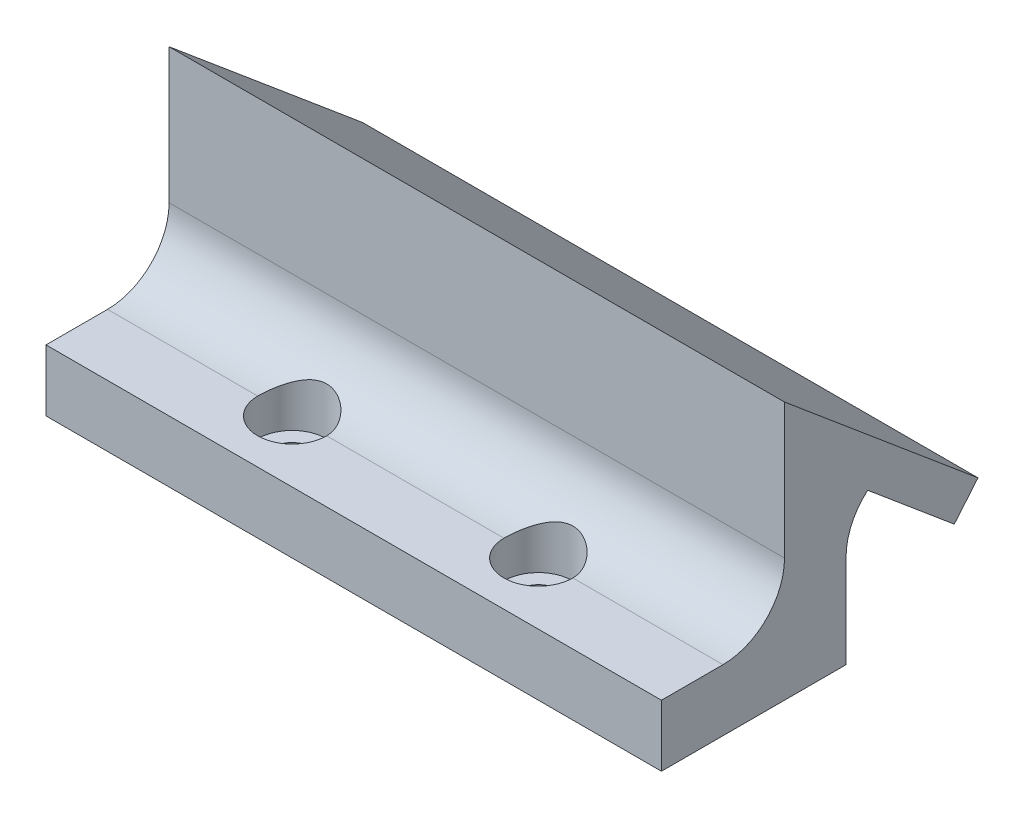
ISO-10303-21;
HEADER;
FILE_DESCRIPTION(('STEP AP214'),'2;1');
FILE_NAME('part.step','',(''),(''),'','','');
FILE_SCHEMA(('AUTOMOTIVE_DESIGN { 1 0 10303 214 1 1 1 1 }'));
ENDSEC;
DATA;
#1=APPLICATION_CONTEXT('core data for automotive mechanical design processes');
#2=APPLICATION_PROTOCOL_DEFINITION('international standard','automotive_design',2000,#1);
#3=PRODUCT_CONTEXT('',#1,'mechanical');
#4=PRODUCT('Part','Part','',(#3));
#5=PRODUCT_RELATED_PRODUCT_CATEGORY('part','',(#4));
#6=PRODUCT_DEFINITION_FORMATION('','',#4);
#7=PRODUCT_DEFINITION_CONTEXT('part definition',#1,'design');
#8=PRODUCT_DEFINITION('design','',#6,#7);
#9=PRODUCT_DEFINITION_SHAPE('','',#8);
#10=(LENGTH_UNIT() NAMED_UNIT(*) SI_UNIT(.MILLI.,.METRE.));
#11=(NAMED_UNIT(*) PLANE_ANGLE_UNIT() SI_UNIT($,.RADIAN.));
#12=(NAMED_UNIT(*) SI_UNIT($,.STERADIAN.) SOLID_ANGLE_UNIT());
#13=UNCERTAINTY_MEASURE_WITH_UNIT(LENGTH_MEASURE(1.E-05),#10,'distance_accuracy_value','');
#14=(GEOMETRIC_REPRESENTATION_CONTEXT(3) GLOBAL_UNCERTAINTY_ASSIGNED_CONTEXT((#13)) GLOBAL_UNIT_ASSIGNED_CONTEXT((#10,
#11,#12)) REPRESENTATION_CONTEXT('',''));
#15=CARTESIAN_POINT('',(0.,0.,0.));
#16=DIRECTION('',(0.,0.,1.));
#17=DIRECTION('',(1.,0.,0.));
#18=AXIS2_PLACEMENT_3D('',#15,#16,#17);
#19=CARTESIAN_POINT('',(5.,5.,-5.));
#20=DIRECTION('',(0.,-1.,0.));
#21=DIRECTION('',(0.,0.,-1.));
#22=AXIS2_PLACEMENT_3D('',#19,#20,#21);
#23=CYLINDRICAL_SURFACE('',#22,1.6);
#24=CARTESIAN_POINT('',(5.,0.,-5.));
#25=DIRECTION('',(0.,1.,0.));
#26=DIRECTION('',(0.,0.,1.));
#27=AXIS2_PLACEMENT_3D('',#24,#25,#26);
#28=CIRCLE('',#27,1.6);
#29=CARTESIAN_POINT('',(5.,0.,-3.4));
#30=VERTEX_POINT('',#29);
#31=EDGE_CURVE('E194',#30,#30,#28,.T.);
#32=ORIENTED_EDGE('',*,*,#31,.F.);
#33=EDGE_LOOP('',(#32));
#34=FACE_BOUND('',#33,.T.);
#35=CARTESIAN_POINT('',(5.,2.,-5.));
#36=DIRECTION('',(0.,1.,0.));
#37=DIRECTION('',(0.,0.,1.));
#38=AXIS2_PLACEMENT_3D('',#35,#36,#37);
#39=CIRCLE('',#38,1.6);
#40=CARTESIAN_POINT('',(5.,2.,-3.4));
#41=VERTEX_POINT('',#40);
#42=EDGE_CURVE('E195',#41,#41,#39,.T.);
#43=ORIENTED_EDGE('',*,*,#42,.T.);
#44=EDGE_LOOP('',(#43));
#45=FACE_BOUND('',#44,.T.);
#46=ADVANCED_FACE('F32',(#34,#45),#23,.F.);
#47=CARTESIAN_POINT('',(25.,5.,-5.));
#48=DIRECTION('',(0.,-1.,0.));
#49=DIRECTION('',(0.,0.,-1.));
#50=AXIS2_PLACEMENT_3D('',#47,#48,#49);
#51=CYLINDRICAL_SURFACE('',#50,1.6);
#52=CARTESIAN_POINT('',(25.,0.,-5.));
#53=DIRECTION('',(0.,1.,0.));
#54=DIRECTION('',(0.,0.,1.));
#55=AXIS2_PLACEMENT_3D('',#52,#53,#54);
#56=CIRCLE('',#55,1.6);
#57=CARTESIAN_POINT('',(25.,0.,-3.4));
#58=VERTEX_POINT('',#57);
#59=EDGE_CURVE('E191',#58,#58,#56,.T.);
#60=ORIENTED_EDGE('',*,*,#59,.F.);
#61=EDGE_LOOP('',(#60));
#62=FACE_BOUND('',#61,.T.);
#63=CARTESIAN_POINT('',(25.,2.,-5.));
#64=DIRECTION('',(0.,1.,0.));
#65=DIRECTION('',(0.,0.,1.));
#66=AXIS2_PLACEMENT_3D('',#63,#64,#65);
#67=CIRCLE('',#66,1.6);
#68=CARTESIAN_POINT('',(25.,2.,-3.4));
#69=VERTEX_POINT('',#68);
#70=EDGE_CURVE('E182',#69,#69,#67,.T.);
#71=ORIENTED_EDGE('',*,*,#70,.T.);
#72=EDGE_LOOP('',(#71));
#73=FACE_BOUND('',#72,.T.);
#74=ADVANCED_FACE('F252',(#62,#73),#51,.F.);
#75=CARTESIAN_POINT('',(0.,5.,0.));
#76=DIRECTION('',(0.,-1.,0.));
#77=DIRECTION('',(0.,0.,-1.));
#78=AXIS2_PLACEMENT_3D('',#75,#76,#77);
#79=PLANE('',#78);
#80=DIRECTION('',(0.,0.,1.));
#81=VECTOR('',#80,1.);
#82=CARTESIAN_POINT('',(40.,5.,-10.));
#83=LINE('',#82,#81);
#84=CARTESIAN_POINT('',(40.,5.,-4.99999999999999));
#85=VERTEX_POINT('',#84);
#86=CARTESIAN_POINT('',(40.,5.,0.));
#87=VERTEX_POINT('',#86);
#88=EDGE_CURVE('E158',#85,#87,#83,.T.);
#89=ORIENTED_EDGE('',*,*,#88,.F.);
#90=DIRECTION('',(-1.,0.,0.));
#91=VECTOR('',#90,1.);
#92=CARTESIAN_POINT('',(-10.,5.,-5.00000000000001));
#93=LINE('',#92,#91);
#94=CARTESIAN_POINT('',(27.8,5.,-4.99999999999999));
#95=VERTEX_POINT('',#94);
#96=EDGE_CURVE('E211',#85,#95,#93,.T.);
#97=ORIENTED_EDGE('',*,*,#96,.T.);
#98=CARTESIAN_POINT('',(25.,5.,-5.));
#99=DIRECTION('',(0.,1.,0.));
#100=DIRECTION('',(0.,0.,1.));
#101=AXIS2_PLACEMENT_3D('',#98,#99,#100);
#102=CIRCLE('',#101,2.8);
#103=CARTESIAN_POINT('',(22.2,5.,-4.99999999999999));
#104=VERTEX_POINT('',#103);
#105=EDGE_CURVE('E178',#104,#95,#102,.T.);
#106=ORIENTED_EDGE('',*,*,#105,.F.);
#107=DIRECTION('',(-1.,0.,0.));
#108=VECTOR('',#107,1.);
#109=CARTESIAN_POINT('',(-10.,5.,-5.00000000000001));
#110=LINE('',#109,#108);
#111=CARTESIAN_POINT('',(7.8,5.,-5.));
#112=VERTEX_POINT('',#111);
#113=EDGE_CURVE('E209',#104,#112,#110,.T.);
#114=ORIENTED_EDGE('',*,*,#113,.T.);
#115=CARTESIAN_POINT('',(5.,5.,-5.));
#116=DIRECTION('',(0.,1.,0.));
#117=DIRECTION('',(0.,0.,1.));
#118=AXIS2_PLACEMENT_3D('',#115,#116,#117);
#119=CIRCLE('',#118,2.8);
#120=CARTESIAN_POINT('',(2.2,5.,-5.));
#121=VERTEX_POINT('',#120);
#122=EDGE_CURVE('E183',#121,#112,#119,.T.);
#123=ORIENTED_EDGE('',*,*,#122,.F.);
#124=DIRECTION('',(-1.,0.,0.));
#125=VECTOR('',#124,1.);
#126=CARTESIAN_POINT('',(-10.,5.,-5.00000000000001));
#127=LINE('',#126,#125);
#128=CARTESIAN_POINT('',(-10.,5.,-5.00000000000001));
#129=VERTEX_POINT('',#128);
#130=EDGE_CURVE('E202',#121,#129,#127,.T.);
#131=ORIENTED_EDGE('',*,*,#130,.T.);
#132=DIRECTION('',(0.,0.,-1.));
#133=VECTOR('',#132,1.);
#134=CARTESIAN_POINT('',(-10.,5.,-10.));
#135=LINE('',#134,#133);
#136=CARTESIAN_POINT('',(-10.,5.,0.));
#137=VERTEX_POINT('',#136);
#138=EDGE_CURVE('E166',#137,#129,#135,.T.);
#139=ORIENTED_EDGE('',*,*,#138,.F.);
#140=DIRECTION('',(1.,0.,0.));
#141=VECTOR('',#140,1.);
#142=CARTESIAN_POINT('',(0.,5.,0.));
#143=LINE('',#142,#141);
#144=EDGE_CURVE('E199',#137,#87,#143,.T.);
#145=ORIENTED_EDGE('',*,*,#144,.T.);
#146=EDGE_LOOP('',(#89,#97,#106,#114,#123,#131,#139,#145));
#147=FACE_BOUND('',#146,.T.);
#148=ADVANCED_FACE('F248',(#147),#79,.F.);
#149=CARTESIAN_POINT('',(0.,0.,0.));
#150=DIRECTION('',(0.,-1.,0.));
#151=DIRECTION('',(0.,0.,-1.));
#152=AXIS2_PLACEMENT_3D('',#149,#150,#151);
#153=PLANE('',#152);
#154=ORIENTED_EDGE('',*,*,#31,.T.);
#155=EDGE_LOOP('',(#154));
#156=FACE_BOUND('',#155,.T.);
#157=DIRECTION('',(1.,0.,0.));
#158=VECTOR('',#157,1.);
#159=CARTESIAN_POINT('',(0.,0.,0.));
#160=LINE('',#159,#158);
#161=CARTESIAN_POINT('',(-10.,0.,0.));
#162=VERTEX_POINT('',#161);
#163=CARTESIAN_POINT('',(40.,0.,0.));
#164=VERTEX_POINT('',#163);
#165=EDGE_CURVE('E198',#162,#164,#160,.T.);
#166=ORIENTED_EDGE('',*,*,#165,.F.);
#167=DIRECTION('',(0.,0.,1.));
#168=VECTOR('',#167,1.);
#169=CARTESIAN_POINT('',(-10.,0.,-10.));
#170=LINE('',#169,#168);
#171=CARTESIAN_POINT('',(-10.,0.,-15.));
#172=VERTEX_POINT('',#171);
#173=EDGE_CURVE('E160',#172,#162,#170,.T.);
#174=ORIENTED_EDGE('',*,*,#173,.F.);
#175=DIRECTION('',(1.,0.,0.));
#176=VECTOR('',#175,1.);
#177=CARTESIAN_POINT('',(-10.,0.,-15.));
#178=LINE('',#177,#176);
#179=CARTESIAN_POINT('',(40.,0.,-15.));
#180=VERTEX_POINT('',#179);
#181=EDGE_CURVE('E175',#172,#180,#178,.T.);
#182=ORIENTED_EDGE('',*,*,#181,.T.);
#183=DIRECTION('',(0.,0.,-1.));
#184=VECTOR('',#183,1.);
#185=CARTESIAN_POINT('',(40.,0.,0.));
#186=LINE('',#185,#184);
#187=EDGE_CURVE('E152',#164,#180,#186,.T.);
#188=ORIENTED_EDGE('',*,*,#187,.F.);
#189=EDGE_LOOP('',(#166,#174,#182,#188));
#190=FACE_BOUND('',#189,.T.);
#191=ORIENTED_EDGE('',*,*,#59,.T.);
#192=EDGE_LOOP('',(#191));
#193=FACE_BOUND('',#192,.T.);
#194=ADVANCED_FACE('F244',(#156,#190,#193),#153,.T.);
#195=CARTESIAN_POINT('',(0.,5.,0.));
#196=DIRECTION('',(0.,0.,-1.));
#197=DIRECTION('',(-1.,0.,0.));
#198=AXIS2_PLACEMENT_3D('',#195,#196,#197);
#199=PLANE('',#198);
#200=ORIENTED_EDGE('',*,*,#165,.T.);
#201=DIRECTION('',(0.,-1.,0.));
#202=VECTOR('',#201,1.);
#203=CARTESIAN_POINT('',(40.,5.,0.));
#204=LINE('',#203,#202);
#205=EDGE_CURVE('E149',#87,#164,#204,.T.);
#206=ORIENTED_EDGE('',*,*,#205,.F.);
#207=ORIENTED_EDGE('',*,*,#144,.F.);
#208=DIRECTION('',(0.,1.,0.));
#209=VECTOR('',#208,1.);
#210=CARTESIAN_POINT('',(-10.,5.,0.));
#211=LINE('',#210,#209);
#212=EDGE_CURVE('E163',#162,#137,#211,.T.);
#213=ORIENTED_EDGE('',*,*,#212,.F.);
#214=EDGE_LOOP('',(#200,#206,#207,#213));
#215=FACE_BOUND('',#214,.T.);
#216=ADVANCED_FACE('F240',(#215),#199,.F.);
#217=CARTESIAN_POINT('',(25.,2.,-5.));
#218=DIRECTION('',(0.,1.,0.));
#219=DIRECTION('',(0.,0.,1.));
#220=AXIS2_PLACEMENT_3D('',#217,#218,#219);
#221=CYLINDRICAL_SURFACE('',#220,2.8);
#222=CARTESIAN_POINT('',(25.,2.,-5.));
#223=DIRECTION('',(0.,1.,0.));
#224=DIRECTION('',(0.,0.,1.));
#225=AXIS2_PLACEMENT_3D('',#222,#223,#224);
#226=CIRCLE('',#225,2.8);
#227=CARTESIAN_POINT('',(25.,2.,-2.2));
#228=VERTEX_POINT('',#227);
#229=EDGE_CURVE('E186',#228,#228,#226,.T.);
#230=ORIENTED_EDGE('',*,*,#229,.F.);
#231=EDGE_LOOP('',(#230));
#232=FACE_BOUND('',#231,.T.);
#233=ORIENTED_EDGE('',*,*,#105,.T.);
#234=CARTESIAN_POINT('',(27.8,5.,-4.99999999999999));
#235=CARTESIAN_POINT('',(27.8000126192588,4.99998601312472,-5.07279241567022));
#236=CARTESIAN_POINT('',(27.7971617749903,5.0015892331611,-5.14557563720954));
#237=CARTESIAN_POINT('',(27.7858311141548,5.00792481182699,-5.29053262710298));
#238=CARTESIAN_POINT('',(27.7773539108875,5.01265571772254,-5.36270666265454));
#239=CARTESIAN_POINT('',(27.754926055572,5.02510951388782,-5.50555509390766));
#240=CARTESIAN_POINT('',(27.7410037349057,5.03281691464609,-5.57623528738965));
#241=CARTESIAN_POINT('',(27.7078700747856,5.0510232543311,-5.71596214610274));
#242=CARTESIAN_POINT('',(27.6886583397865,5.06152240202423,-5.78500868874901));
#243=CARTESIAN_POINT('',(27.6234613019935,5.09681823866923,-5.98880111496992));
#244=CARTESIAN_POINT('',(27.5698596709923,5.12544467793267,-6.12053955595062));
#245=CARTESIAN_POINT('',(27.4443766963702,5.19041538249203,-6.37293869664888));
#246=CARTESIAN_POINT('',(27.3724748746711,5.2267682862057,-6.49358677892571));
#247=CARTESIAN_POINT('',(27.2068119832663,5.30698414120924,-6.72980047729093));
#248=CARTESIAN_POINT('',(27.1118753202332,5.3511942070472,-6.84442330056216));
#249=CARTESIAN_POINT('',(26.9054330895384,5.44126720443915,-7.05701658684002));
#250=CARTESIAN_POINT('',(26.7939118046691,5.48713167229175,-7.15497106239085));
#251=CARTESIAN_POINT('',(26.5437776406316,5.58090114724058,-7.3417016232965));
#252=CARTESIAN_POINT('',(26.4035556704179,5.62852649346677,-7.42848023070925));
#253=CARTESIAN_POINT('',(26.107759278362,5.71429715607025,-7.57684668047029));
#254=CARTESIAN_POINT('',(25.9522078945039,5.75245640403028,-7.6384716296407));
#255=CARTESIAN_POINT('',(25.6641729510852,5.80648046491585,-7.72329985246293));
#256=CARTESIAN_POINT('',(25.5338435971426,5.82536420171947,-7.75189401609168));
#257=CARTESIAN_POINT('',(25.269308952908,5.85087139202225,-7.79021262840044));
#258=CARTESIAN_POINT('',(25.1351076393797,5.8575069997297,-7.79995578399908));
#259=CARTESIAN_POINT('',(24.8665440392472,5.85756676689865,-7.80004397547245));
#260=CARTESIAN_POINT('',(24.7321817474793,5.8509755061371,-7.79036637012489));
#261=CARTESIAN_POINT('',(24.4673471502753,5.82551838594795,-7.75212819857548));
#262=CARTESIAN_POINT('',(24.3368773998415,5.80664464214648,-7.723555503043));
#263=CARTESIAN_POINT('',(24.0831298088093,5.75911696405302,-7.64893207360715));
#264=CARTESIAN_POINT('',(23.959845882105,5.730471451246,-7.60289638580845));
#265=CARTESIAN_POINT('',(23.7223493578851,5.66649310264978,-7.49492482660402));
#266=CARTESIAN_POINT('',(23.608140498645,5.63115753110377,-7.43298244679016));
#267=CARTESIAN_POINT('',(23.3733378850603,5.55117731196457,-7.28389382073814));
#268=CARTESIAN_POINT('',(23.2544760380035,5.50593744769173,-7.1943338040606));
#269=CARTESIAN_POINT('',(23.0323764514554,5.41510532041184,-6.9976270304732));
#270=CARTESIAN_POINT('',(22.9291528339514,5.36951277750616,-6.89046455763669));
#271=CARTESIAN_POINT('',(22.7303131703048,5.27740454575841,-6.64789611393537));
#272=CARTESIAN_POINT('',(22.636645208127,5.23129790967822,-6.51070385621199));
#273=CARTESIAN_POINT('',(22.5148836239945,5.1694098427908,-6.2927260542263));
#274=CARTESIAN_POINT('',(22.4774257996207,5.14999582570145,-6.21805239947647));
#275=CARTESIAN_POINT('',(22.4091279558927,5.11412555441173,-6.06507429899998));
#276=CARTESIAN_POINT('',(22.3782838655198,5.09766748172808,-5.9867721230844));
#277=CARTESIAN_POINT('',(22.3263401221466,5.06968274166836,-5.83505728422271));
#278=CARTESIAN_POINT('',(22.304576984013,5.05782867024697,-5.76193119148331));
#279=CARTESIAN_POINT('',(22.2670219917908,5.03724640932448,-5.61373676298384));
#280=CARTESIAN_POINT('',(22.2512290526789,5.02851765184447,-5.5386687827943));
#281=CARTESIAN_POINT('',(22.2257590244483,5.01439137660924,-5.38671731526305));
#282=CARTESIAN_POINT('',(22.2161196070238,5.00901438288609,-5.30982557845581));
#283=CARTESIAN_POINT('',(22.2032294739358,5.00180823793576,-5.15529306996077));
#284=CARTESIAN_POINT('',(22.1999830569199,4.99998147389048,-5.07765182953498));
#285=CARTESIAN_POINT('',(22.2,5.,-5.));
#286=B_SPLINE_CURVE_WITH_KNOTS('',3,(#234,#235,#236,#237,#238,#239,#240,#241,#242,#243,#244,
#245,#246,#247,#248,#249,#250,#251,#252,#253,#254,#255,#256,#257,#258,#259,#260,#261,#262,#263,
#264,#265,#266,#267,#268,#269,#270,#271,#272,#273,#274,#275,#276,#277,#278,#279,#280,#281,#282,
#283,#284,#285),.UNSPECIFIED.,.F.,.F.,(4,2,2,2,2,2,2,2,2,2,2,2,2,2,2,2,2,2,2,2,2,2,2,2,2,4),(0.,
0.218288596011022,0.436475873447967,0.653542692758751,0.870625748858909,1.30376844272026,
1.73739797466487,2.20129948349906,2.66564346594372,3.17801869585317,3.68963531102425,
4.0921540282531,4.49427309816508,4.896861241171,5.29970806888901,5.70220858947327,
6.10487406096022,6.56964228967561,7.03482775371849,7.54903613430851,7.80603100005664,
8.0628672181312,8.29419957513107,8.52548986958242,8.75818287120413,8.99103228202939),.UNSPECIFIED.);
#287=EDGE_CURVE('E217',#95,#104,#286,.T.);
#288=ORIENTED_EDGE('',*,*,#287,.T.);
#289=EDGE_LOOP('',(#233,#288));
#290=FACE_BOUND('',#289,.T.);
#291=ADVANCED_FACE('F231',(#232,#290),#221,.F.);
#292=CARTESIAN_POINT('',(25.,2.,-5.));
#293=DIRECTION('',(0.,1.,0.));
#294=DIRECTION('',(0.,0.,1.));
#295=AXIS2_PLACEMENT_3D('',#292,#293,#294);
#296=PLANE('',#295);
#297=ORIENTED_EDGE('',*,*,#70,.F.);
#298=EDGE_LOOP('',(#297));
#299=FACE_BOUND('',#298,.T.);
#300=ORIENTED_EDGE('',*,*,#229,.T.);
#301=EDGE_LOOP('',(#300));
#302=FACE_BOUND('',#301,.T.);
#303=ADVANCED_FACE('F264',(#299,#302),#296,.T.);
#304=CARTESIAN_POINT('',(5.,2.,-5.));
#305=DIRECTION('',(0.,1.,0.));
#306=DIRECTION('',(0.,0.,1.));
#307=AXIS2_PLACEMENT_3D('',#304,#305,#306);
#308=CYLINDRICAL_SURFACE('',#307,2.8);
#309=CARTESIAN_POINT('',(5.,2.,-5.));
#310=DIRECTION('',(0.,1.,0.));
#311=DIRECTION('',(0.,0.,1.));
#312=AXIS2_PLACEMENT_3D('',#309,#310,#311);
#313=CIRCLE('',#312,2.8);
#314=CARTESIAN_POINT('',(5.,2.,-2.2));
#315=VERTEX_POINT('',#314);
#316=EDGE_CURVE('E179',#315,#315,#313,.T.);
#317=ORIENTED_EDGE('',*,*,#316,.F.);
#318=EDGE_LOOP('',(#317));
#319=FACE_BOUND('',#318,.T.);
#320=ORIENTED_EDGE('',*,*,#122,.T.);
#321=CARTESIAN_POINT('',(7.8,5.,-5.));
#322=CARTESIAN_POINT('',(7.80001261925879,4.99998601312472,-5.07279241567022));
#323=CARTESIAN_POINT('',(7.79716177499028,5.0015892331611,-5.14557563720954));
#324=CARTESIAN_POINT('',(7.78583111415482,5.00792481182699,-5.29053262710299));
#325=CARTESIAN_POINT('',(7.77735391088753,5.01265571772254,-5.36270666265454));
#326=CARTESIAN_POINT('',(7.75492605557198,5.02510951388782,-5.50555509390767));
#327=CARTESIAN_POINT('',(7.74100373490567,5.03281691464609,-5.57623528738966));
#328=CARTESIAN_POINT('',(7.70787007478559,5.0510232543311,-5.71596214610274));
#329=CARTESIAN_POINT('',(7.68865833978646,5.06152240202423,-5.78500868874902));
#330=CARTESIAN_POINT('',(7.6234613019935,5.09681823866923,-5.98880111496993));
#331=CARTESIAN_POINT('',(7.56985967099229,5.12544467793267,-6.12053955595063));
#332=CARTESIAN_POINT('',(7.44437669637023,5.19041538249203,-6.37293869664889));
#333=CARTESIAN_POINT('',(7.37247487467112,5.2267682862057,-6.49358677892572));
#334=CARTESIAN_POINT('',(7.2068119832663,5.30698414120924,-6.72980047729093));
#335=CARTESIAN_POINT('',(7.11187532023314,5.3511942070472,-6.84442330056217));
#336=CARTESIAN_POINT('',(6.90543308953843,5.44126720443915,-7.05701658684003));
#337=CARTESIAN_POINT('',(6.79391180466908,5.48713167229175,-7.15497106239086));
#338=CARTESIAN_POINT('',(6.54377764063163,5.58090114724058,-7.34170162329651));
#339=CARTESIAN_POINT('',(6.40355567041786,5.62852649346676,-7.42848023070925));
#340=CARTESIAN_POINT('',(6.10775927836194,5.71429715607025,-7.57684668047029));
#341=CARTESIAN_POINT('',(5.95220789450394,5.75245640403028,-7.63847162964071));
#342=CARTESIAN_POINT('',(5.66417295108516,5.80648046491585,-7.72329985246293));
#343=CARTESIAN_POINT('',(5.53384359714257,5.82536420171946,-7.75189401609168));
#344=CARTESIAN_POINT('',(5.26930895290803,5.85087139202225,-7.79021262840044));
#345=CARTESIAN_POINT('',(5.13510763937966,5.8575069997297,-7.79995578399908));
#346=CARTESIAN_POINT('',(4.86654403924724,5.85756676689864,-7.80004397547245));
#347=CARTESIAN_POINT('',(4.73218174747925,5.8509755061371,-7.79036637012489));
#348=CARTESIAN_POINT('',(4.46734715027532,5.82551838594794,-7.75212819857548));
#349=CARTESIAN_POINT('',(4.33687739984148,5.80664464214648,-7.723555503043));
#350=CARTESIAN_POINT('',(4.08312980880931,5.75911696405302,-7.64893207360714));
#351=CARTESIAN_POINT('',(3.95984588210503,5.73047145124599,-7.60289638580845));
#352=CARTESIAN_POINT('',(3.7223493578851,5.66649310264977,-7.49492482660401));
#353=CARTESIAN_POINT('',(3.60814049864499,5.63115753110377,-7.43298244679016));
#354=CARTESIAN_POINT('',(3.37333788506028,5.55117731196457,-7.28389382073813));
#355=CARTESIAN_POINT('',(3.25447603800349,5.50593744769173,-7.19433380406059));
#356=CARTESIAN_POINT('',(3.03237645145543,5.41510532041183,-6.99762703047319));
#357=CARTESIAN_POINT('',(2.92915283395134,5.36951277750615,-6.89046455763668));
#358=CARTESIAN_POINT('',(2.73031317030476,5.27740454575841,-6.64789611393536));
#359=CARTESIAN_POINT('',(2.63664520812703,5.23129790967821,-6.51070385621198));
#360=CARTESIAN_POINT('',(2.51488362399448,5.16940984279079,-6.29272605422629));
#361=CARTESIAN_POINT('',(2.47742579962072,5.14999582570144,-6.21805239947646));
#362=CARTESIAN_POINT('',(2.40912795589269,5.11412555441172,-6.06507429899997));
#363=CARTESIAN_POINT('',(2.37828386551975,5.09766748172807,-5.98677212308438));
#364=CARTESIAN_POINT('',(2.32634012214658,5.06968274166835,-5.8350572842227));
#365=CARTESIAN_POINT('',(2.30457698401303,5.05782867024697,-5.7619311914833));
#366=CARTESIAN_POINT('',(2.26702199179079,5.03724640932448,-5.61373676298383));
#367=CARTESIAN_POINT('',(2.25122905267889,5.02851765184447,-5.53866878279429));
#368=CARTESIAN_POINT('',(2.2257590244483,5.01439137660924,-5.38671731526304));
#369=CARTESIAN_POINT('',(2.21611960702375,5.00901438288608,-5.30982557845581));
#370=CARTESIAN_POINT('',(2.20322947393583,5.00180823793576,-5.15529306996077));
#371=CARTESIAN_POINT('',(2.19998305691991,4.99998147389048,-5.07765182953498));
#372=CARTESIAN_POINT('',(2.2,5.,-5.));
#373=B_SPLINE_CURVE_WITH_KNOTS('',3,(#321,#322,#323,#324,#325,#326,#327,#328,#329,#330,#331,
#332,#333,#334,#335,#336,#337,#338,#339,#340,#341,#342,#343,#344,#345,#346,#347,#348,#349,#350,
#351,#352,#353,#354,#355,#356,#357,#358,#359,#360,#361,#362,#363,#364,#365,#366,#367,#368,#369,
#370,#371,#372),.UNSPECIFIED.,.F.,.F.,(4,2,2,2,2,2,2,2,2,2,2,2,2,2,2,2,2,2,2,2,2,2,2,2,2,4),(0.,
0.218288596011022,0.436475873447967,0.653542692758753,0.870625748858912,1.30376844272026,
1.73739797466488,2.20129948349907,2.66564346594372,3.17801869585317,3.68963531102425,
4.0921540282531,4.49427309816508,4.89686124117101,5.29970806888902,5.70220858947328,
6.10487406096022,6.56964228967562,7.0348277537185,7.54903613430852,7.80603100005665,
8.06286721813121,8.29419957513108,8.52548986958243,8.75818287120413,8.99103228202938),.UNSPECIFIED.);
#374=EDGE_CURVE('E224',#112,#121,#373,.T.);
#375=ORIENTED_EDGE('',*,*,#374,.T.);
#376=EDGE_LOOP('',(#320,#375));
#377=FACE_BOUND('',#376,.T.);
#378=ADVANCED_FACE('F267',(#319,#377),#308,.F.);
#379=CARTESIAN_POINT('',(5.,2.,-5.));
#380=DIRECTION('',(0.,1.,0.));
#381=DIRECTION('',(0.,0.,1.));
#382=AXIS2_PLACEMENT_3D('',#379,#380,#381);
#383=PLANE('',#382);
#384=ORIENTED_EDGE('',*,*,#42,.F.);
#385=EDGE_LOOP('',(#384));
#386=FACE_BOUND('',#385,.T.);
#387=ORIENTED_EDGE('',*,*,#316,.T.);
#388=EDGE_LOOP('',(#387));
#389=FACE_BOUND('',#388,.T.);
#390=ADVANCED_FACE('F306',(#386,#389),#383,.T.);
#391=CARTESIAN_POINT('',(-10.,20.9774907794318,-10.));
#392=DIRECTION('',(0.,0.,-1.));
#393=DIRECTION('',(0.,1.,0.));
#394=AXIS2_PLACEMENT_3D('',#391,#392,#393);
#395=PLANE('',#394);
#396=DIRECTION('',(-1.,0.,0.));
#397=VECTOR('',#396,1.);
#398=CARTESIAN_POINT('',(40.,10.,-9.99999999999999));
#399=LINE('',#398,#397);
#400=CARTESIAN_POINT('',(-10.,10.,-10.));
#401=VERTEX_POINT('',#400);
#402=CARTESIAN_POINT('',(40.,10.,-9.99999999999999));
#403=VERTEX_POINT('',#402);
#404=EDGE_CURVE('E214',#401,#403,#399,.F.);
#405=ORIENTED_EDGE('',*,*,#404,.T.);
#406=DIRECTION('',(0.,-1.,0.));
#407=VECTOR('',#406,1.);
#408=CARTESIAN_POINT('',(40.,20.9774907794318,-9.99999999999998));
#409=LINE('',#408,#407);
#410=CARTESIAN_POINT('',(40.,20.9774907794318,-9.99999999999998));
#411=VERTEX_POINT('',#410);
#412=EDGE_CURVE('E131',#411,#403,#409,.T.);
#413=ORIENTED_EDGE('',*,*,#412,.F.);
#414=DIRECTION('',(1.,0.,0.));
#415=VECTOR('',#414,1.);
#416=CARTESIAN_POINT('',(-10.,20.9774907794318,-10.));
#417=LINE('',#416,#415);
#418=CARTESIAN_POINT('',(-10.,20.9774907794318,-10.));
#419=VERTEX_POINT('',#418);
#420=EDGE_CURVE('E128',#419,#411,#417,.T.);
#421=ORIENTED_EDGE('',*,*,#420,.F.);
#422=DIRECTION('',(0.,1.,0.));
#423=VECTOR('',#422,1.);
#424=CARTESIAN_POINT('',(-10.,5.,-10.));
#425=LINE('',#424,#423);
#426=EDGE_CURVE('E169',#401,#419,#425,.T.);
#427=ORIENTED_EDGE('',*,*,#426,.F.);
#428=EDGE_LOOP('',(#405,#413,#421,#427));
#429=FACE_BOUND('',#428,.T.);
#430=ADVANCED_FACE('F311',(#429),#395,.F.);
#431=CARTESIAN_POINT('',(-10.,16.7819926235454,-15.));
#432=DIRECTION('',(0.,-0.766044443118981,0.642787609686536));
#433=DIRECTION('',(0.,-0.642787609686536,-0.766044443118981));
#434=AXIS2_PLACEMENT_3D('',#431,#432,#433);
#435=PLANE('',#434);
#436=ORIENTED_EDGE('',*,*,#420,.T.);
#437=DIRECTION('',(0.,0.642787609686535,0.766044443118982));
#438=VECTOR('',#437,1.);
#439=CARTESIAN_POINT('',(40.,12.5864944676591,-20.));
#440=LINE('',#439,#438);
#441=CARTESIAN_POINT('',(40.,7.78922526643425,-25.7171628052013));
#442=VERTEX_POINT('',#441);
#443=EDGE_CURVE('E120',#442,#411,#440,.T.);
#444=ORIENTED_EDGE('',*,*,#443,.F.);
#445=DIRECTION('',(-1.,0.,0.));
#446=VECTOR('',#445,1.);
#447=CARTESIAN_POINT('',(62.0648534042191,7.78922526643425,-25.7171628052012));
#448=LINE('',#447,#446);
#449=CARTESIAN_POINT('',(-9.99999999999999,7.78922526643425,-25.7171628052013));
#450=VERTEX_POINT('',#449);
#451=EDGE_CURVE('E125',#442,#450,#448,.T.);
#452=ORIENTED_EDGE('',*,*,#451,.T.);
#453=DIRECTION('',(0.,-0.642787609686535,-0.766044443118982));
#454=VECTOR('',#453,1.);
#455=CARTESIAN_POINT('',(-10.,16.7819926235454,-15.));
#456=LINE('',#455,#454);
#457=EDGE_CURVE('E171',#419,#450,#456,.T.);
#458=ORIENTED_EDGE('',*,*,#457,.F.);
#459=EDGE_LOOP('',(#436,#444,#452,#458));
#460=FACE_BOUND('',#459,.T.);
#461=ADVANCED_FACE('F122',(#460),#435,.F.);
#462=CARTESIAN_POINT('',(-10.,0.,-15.));
#463=DIRECTION('',(0.,0.,1.));
#464=DIRECTION('',(1.,0.,0.));
#465=AXIS2_PLACEMENT_3D('',#462,#463,#464);
#466=PLANE('',#465);
#467=DIRECTION('',(0.,-1.,0.));
#468=VECTOR('',#467,1.);
#469=CARTESIAN_POINT('',(-10.,0.,-15.));
#470=LINE('',#469,#468);
#471=CARTESIAN_POINT('',(-10.,7.58649446765905,-15.));
#472=VERTEX_POINT('',#471);
#473=EDGE_CURVE('E173',#472,#172,#470,.T.);
#474=ORIENTED_EDGE('',*,*,#473,.F.);
#475=DIRECTION('',(1.,0.,0.));
#476=VECTOR('',#475,1.);
#477=CARTESIAN_POINT('',(40.,7.58649446765905,-15.));
#478=LINE('',#477,#476);
#479=CARTESIAN_POINT('',(40.,7.58649446765905,-15.));
#480=VERTEX_POINT('',#479);
#481=EDGE_CURVE('E285',#472,#480,#478,.T.);
#482=ORIENTED_EDGE('',*,*,#481,.T.);
#483=DIRECTION('',(0.,1.,0.));
#484=VECTOR('',#483,1.);
#485=CARTESIAN_POINT('',(40.,0.,-15.));
#486=LINE('',#485,#484);
#487=EDGE_CURVE('E132',#180,#480,#486,.T.);
#488=ORIENTED_EDGE('',*,*,#487,.F.);
#489=ORIENTED_EDGE('',*,*,#181,.F.);
#490=EDGE_LOOP('',(#474,#482,#488,#489));
#491=FACE_BOUND('',#490,.T.);
#492=ADVANCED_FACE('F295',(#491),#466,.F.);
#493=CARTESIAN_POINT('',(-10.,0.,0.));
#494=DIRECTION('',(1.,0.,0.));
#495=DIRECTION('',(0.,0.,-1.));
#496=AXIS2_PLACEMENT_3D('',#493,#494,#495);
#497=PLANE('',#496);
#498=ORIENTED_EDGE('',*,*,#426,.T.);
#499=ORIENTED_EDGE('',*,*,#457,.T.);
#500=DIRECTION('',(0.,-0.766044443118982,0.642787609686535));
#501=VECTOR('',#500,1.);
#502=CARTESIAN_POINT('',(-9.99999999999999,7.78922526643425,-25.7171628052013));
#503=LINE('',#502,#501);
#504=CARTESIAN_POINT('',(-9.99999999999999,5.4910919370773,-23.7887999761417));
#505=VERTEX_POINT('',#504);
#506=EDGE_CURVE('E143',#450,#505,#503,.T.);
#507=ORIENTED_EDGE('',*,*,#506,.T.);
#508=DIRECTION('',(0.,0.642787609686535,0.766044443118981));
#509=VECTOR('',#508,1.);
#510=CARTESIAN_POINT('',(-9.99999999999999,5.4910919370773,-23.7887999761417));
#511=LINE('',#510,#509);
#512=CARTESIAN_POINT('',(-10.,11.3918046114617,-16.7566044475778));
#513=VERTEX_POINT('',#512);
#514=EDGE_CURVE('E144',#505,#513,#511,.T.);
#515=ORIENTED_EDGE('',*,*,#514,.T.);
#516=CARTESIAN_POINT('',(-9.99999999999999,7.58649446765905,-20.));
#517=DIRECTION('',(1.,0.,0.));
#518=DIRECTION('',(0.,0.,-1.));
#519=AXIS2_PLACEMENT_3D('',#516,#517,#518);
#520=CIRCLE('',#519,5.);
#521=EDGE_CURVE('E40',#513,#472,#520,.T.);
#522=ORIENTED_EDGE('',*,*,#521,.T.);
#523=ORIENTED_EDGE('',*,*,#473,.T.);
#524=ORIENTED_EDGE('',*,*,#173,.T.);
#525=ORIENTED_EDGE('',*,*,#212,.T.);
#526=ORIENTED_EDGE('',*,*,#138,.T.);
#527=CARTESIAN_POINT('',(-10.,10.,-5.00000000000001));
#528=DIRECTION('',(1.,0.,0.));
#529=DIRECTION('',(0.,0.,-1.));
#530=AXIS2_PLACEMENT_3D('',#527,#528,#529);
#531=CIRCLE('',#530,5.);
#532=EDGE_CURVE('E282',#129,#401,#531,.T.);
#533=ORIENTED_EDGE('',*,*,#532,.T.);
#534=EDGE_LOOP('',(#498,#499,#507,#515,#522,#523,#524,#525,#526,#533));
#535=FACE_BOUND('',#534,.T.);
#536=ADVANCED_FACE('F298',(#535),#497,.F.);
#537=CARTESIAN_POINT('',(40.,0.,0.));
#538=DIRECTION('',(1.,0.,0.));
#539=DIRECTION('',(0.,0.,-1.));
#540=AXIS2_PLACEMENT_3D('',#537,#538,#539);
#541=PLANE('',#540);
#542=CARTESIAN_POINT('',(40.,7.58649446765905,-20.));
#543=DIRECTION('',(1.,0.,0.));
#544=DIRECTION('',(0.,0.,-1.));
#545=AXIS2_PLACEMENT_3D('',#542,#543,#544);
#546=CIRCLE('',#545,5.);
#547=CARTESIAN_POINT('',(40.,11.3918046114617,-16.7566044475777));
#548=VERTEX_POINT('',#547);
#549=EDGE_CURVE('E290',#480,#548,#546,.F.);
#550=ORIENTED_EDGE('',*,*,#549,.T.);
#551=DIRECTION('',(0.,0.642787609686535,0.766044443118982));
#552=VECTOR('',#551,1.);
#553=CARTESIAN_POINT('',(40.,5.4910919370773,-23.7887999761417));
#554=LINE('',#553,#552);
#555=CARTESIAN_POINT('',(40.,5.4910919370773,-23.7887999761417));
#556=VERTEX_POINT('',#555);
#557=EDGE_CURVE('E47',#556,#548,#554,.T.);
#558=ORIENTED_EDGE('',*,*,#557,.F.);
#559=DIRECTION('',(0.,-0.766044443118982,0.642787609686535));
#560=VECTOR('',#559,1.);
#561=CARTESIAN_POINT('',(40.,7.78922526643425,-25.7171628052013));
#562=LINE('',#561,#560);
#563=EDGE_CURVE('E135',#442,#556,#562,.T.);
#564=ORIENTED_EDGE('',*,*,#563,.F.);
#565=ORIENTED_EDGE('',*,*,#443,.T.);
#566=ORIENTED_EDGE('',*,*,#412,.T.);
#567=CARTESIAN_POINT('',(40.,10.,-4.99999999999999));
#568=DIRECTION('',(1.,0.,0.));
#569=DIRECTION('',(0.,0.,-1.));
#570=AXIS2_PLACEMENT_3D('',#567,#568,#569);
#571=CIRCLE('',#570,5.);
#572=EDGE_CURVE('E283',#403,#85,#571,.F.);
#573=ORIENTED_EDGE('',*,*,#572,.T.);
#574=ORIENTED_EDGE('',*,*,#88,.T.);
#575=ORIENTED_EDGE('',*,*,#205,.T.);
#576=ORIENTED_EDGE('',*,*,#187,.T.);
#577=ORIENTED_EDGE('',*,*,#487,.T.);
#578=EDGE_LOOP('',(#550,#558,#564,#565,#566,#573,#574,#575,#576,#577));
#579=FACE_BOUND('',#578,.T.);
#580=ADVANCED_FACE('F137',(#579),#541,.T.);
#581=CARTESIAN_POINT('',(0.,10.,-5.));
#582=DIRECTION('',(1.,0.,0.));
#583=DIRECTION('',(0.,0.,-1.));
#584=AXIS2_PLACEMENT_3D('',#581,#582,#583);
#585=CYLINDRICAL_SURFACE('',#584,5.);
#586=ORIENTED_EDGE('',*,*,#572,.F.);
#587=ORIENTED_EDGE('',*,*,#404,.F.);
#588=ORIENTED_EDGE('',*,*,#532,.F.);
#589=ORIENTED_EDGE('',*,*,#130,.F.);
#590=ORIENTED_EDGE('',*,*,#374,.F.);
#591=ORIENTED_EDGE('',*,*,#113,.F.);
#592=ORIENTED_EDGE('',*,*,#287,.F.);
#593=ORIENTED_EDGE('',*,*,#96,.F.);
#594=EDGE_LOOP('',(#586,#587,#588,#589,#590,#591,#592,#593));
#595=FACE_BOUND('',#594,.T.);
#596=ADVANCED_FACE('F235',(#595),#585,.F.);
#597=CARTESIAN_POINT('',(-9.99999999999999,7.58649446765905,-20.));
#598=DIRECTION('',(-1.,0.,0.));
#599=DIRECTION('',(0.,0.,1.));
#600=AXIS2_PLACEMENT_3D('',#597,#598,#599);
#601=CYLINDRICAL_SURFACE('',#600,5.);
#602=ORIENTED_EDGE('',*,*,#521,.F.);
#603=DIRECTION('',(-1.,0.,0.));
#604=VECTOR('',#603,1.);
#605=CARTESIAN_POINT('',(-10.,11.3918046114617,-16.7566044475778));
#606=LINE('',#605,#604);
#607=EDGE_CURVE('E11',#513,#548,#606,.F.);
#608=ORIENTED_EDGE('',*,*,#607,.T.);
#609=ORIENTED_EDGE('',*,*,#549,.F.);
#610=ORIENTED_EDGE('',*,*,#481,.F.);
#611=EDGE_LOOP('',(#602,#608,#609,#610));
#612=FACE_BOUND('',#611,.T.);
#613=ADVANCED_FACE('F34',(#612),#601,.F.);
#614=CARTESIAN_POINT('',(62.0648534042191,5.4910919370773,-23.7887999761416));
#615=DIRECTION('',(0.,-0.766044443118981,0.642787609686535));
#616=DIRECTION('',(0.,-0.642787609686535,-0.766044443118982));
#617=AXIS2_PLACEMENT_3D('',#614,#615,#616);
#618=PLANE('',#617);
#619=ORIENTED_EDGE('',*,*,#607,.F.);
#620=ORIENTED_EDGE('',*,*,#514,.F.);
#621=DIRECTION('',(-1.,0.,0.));
#622=VECTOR('',#621,1.);
#623=CARTESIAN_POINT('',(62.0648534042191,5.4910919370773,-23.7887999761416));
#624=LINE('',#623,#622);
#625=EDGE_CURVE('E139',#556,#505,#624,.T.);
#626=ORIENTED_EDGE('',*,*,#625,.F.);
#627=ORIENTED_EDGE('',*,*,#557,.T.);
#628=EDGE_LOOP('',(#619,#620,#626,#627));
#629=FACE_BOUND('',#628,.T.);
#630=ADVANCED_FACE('F330',(#629),#618,.T.);
#631=CARTESIAN_POINT('',(62.0648534042191,7.78922526643425,-25.7171628052012));
#632=DIRECTION('',(0.,-0.642787609686535,-0.766044443118982));
#633=DIRECTION('',(0.,0.766044443118982,-0.642787609686535));
#634=AXIS2_PLACEMENT_3D('',#631,#632,#633);
#635=PLANE('',#634);
#636=ORIENTED_EDGE('',*,*,#451,.F.);
#637=ORIENTED_EDGE('',*,*,#563,.T.);
#638=ORIENTED_EDGE('',*,*,#625,.T.);
#639=ORIENTED_EDGE('',*,*,#506,.F.);
#640=EDGE_LOOP('',(#636,#637,#638,#639));
#641=FACE_BOUND('',#640,.T.);
#642=ADVANCED_FACE('F141',(#641),#635,.T.);
#643=CLOSED_SHELL('',(#46,#74,#148,#194,#216,#291,#303,#378,#390,#430,#461,#492,#536,#580,#596,
#613,#630,#642));
#644=MANIFOLD_SOLID_BREP('B2',#643);
#645=ADVANCED_BREP_SHAPE_REPRESENTATION('',(#18,#644),#14);
#646=SHAPE_DEFINITION_REPRESENTATION(#9,#645);
ENDSEC;
END-ISO-10303-21;
